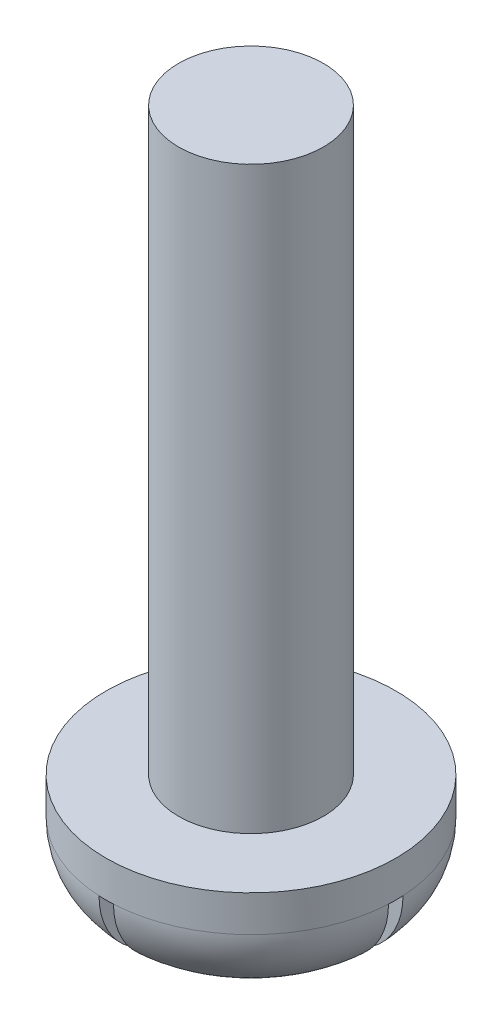
ISO-10303-21;
HEADER;
FILE_DESCRIPTION(('STEP AP214'),'2;1');
FILE_NAME('part.step','',(''),(''),'','','');
FILE_SCHEMA(('AUTOMOTIVE_DESIGN { 1 0 10303 214 1 1 1 1 }'));
ENDSEC;
DATA;
#1=APPLICATION_CONTEXT('core data for automotive mechanical design processes');
#2=APPLICATION_PROTOCOL_DEFINITION('international standard','automotive_design',2000,#1);
#3=PRODUCT_CONTEXT('',#1,'mechanical');
#4=PRODUCT('Part','Part','',(#3));
#5=PRODUCT_RELATED_PRODUCT_CATEGORY('part','',(#4));
#6=PRODUCT_DEFINITION_FORMATION('','',#4);
#7=PRODUCT_DEFINITION_CONTEXT('part definition',#1,'design');
#8=PRODUCT_DEFINITION('design','',#6,#7);
#9=PRODUCT_DEFINITION_SHAPE('','',#8);
#10=(LENGTH_UNIT() NAMED_UNIT(*) SI_UNIT(.MILLI.,.METRE.));
#11=(NAMED_UNIT(*) PLANE_ANGLE_UNIT() SI_UNIT($,.RADIAN.));
#12=(NAMED_UNIT(*) SI_UNIT($,.STERADIAN.) SOLID_ANGLE_UNIT());
#13=UNCERTAINTY_MEASURE_WITH_UNIT(LENGTH_MEASURE(1.E-05),#10,'distance_accuracy_value','');
#14=(GEOMETRIC_REPRESENTATION_CONTEXT(3) GLOBAL_UNCERTAINTY_ASSIGNED_CONTEXT((#13)) GLOBAL_UNIT_ASSIGNED_CONTEXT((#10,
#11,#12)) REPRESENTATION_CONTEXT('',''));
#15=CARTESIAN_POINT('',(0.,0.,0.));
#16=DIRECTION('',(0.,0.,1.));
#17=DIRECTION('',(1.,0.,0.));
#18=AXIS2_PLACEMENT_3D('',#15,#16,#17);
#19=CARTESIAN_POINT('',(0.,-1.5,0.));
#20=DIRECTION('',(0.,1.,0.));
#21=DIRECTION('',(0.,0.,1.));
#22=AXIS2_PLACEMENT_3D('',#19,#20,#21);
#23=CYLINDRICAL_SURFACE('',#22,2.);
#24=CARTESIAN_POINT('',(0.,0.,0.));
#25=DIRECTION('',(0.,1.,0.));
#26=DIRECTION('',(0.,0.,1.));
#27=AXIS2_PLACEMENT_3D('',#24,#25,#26);
#28=CIRCLE('',#27,2.);
#29=CARTESIAN_POINT('',(0.,0.,2.));
#30=VERTEX_POINT('',#29);
#31=EDGE_CURVE('E231',#30,#30,#28,.T.);
#32=ORIENTED_EDGE('',*,*,#31,.F.);
#33=EDGE_LOOP('',(#32));
#34=FACE_BOUND('',#33,.T.);
#35=CARTESIAN_POINT('',(0.,-0.5,0.));
#36=DIRECTION('',(0.,1.,0.));
#37=DIRECTION('',(0.,0.,1.));
#38=AXIS2_PLACEMENT_3D('',#35,#36,#37);
#39=CIRCLE('',#38,2.);
#40=CARTESIAN_POINT('',(0.100000000000001,-0.5,1.99749843554382));
#41=VERTEX_POINT('',#40);
#42=CARTESIAN_POINT('',(-0.0999999999999994,-0.5,1.99749843554382));
#43=VERTEX_POINT('',#42);
#44=EDGE_CURVE('E257',#41,#43,#39,.F.);
#45=ORIENTED_EDGE('',*,*,#44,.F.);
#46=CARTESIAN_POINT('',(0.,-0.5,0.));
#47=DIRECTION('',(0.,1.,0.));
#48=DIRECTION('',(0.,0.,1.));
#49=AXIS2_PLACEMENT_3D('',#46,#47,#48);
#50=CIRCLE('',#49,2.);
#51=CARTESIAN_POINT('',(1.99749843554382,-0.5,0.1));
#52=VERTEX_POINT('',#51);
#53=EDGE_CURVE('E267',#41,#52,#50,.T.);
#54=ORIENTED_EDGE('',*,*,#53,.T.);
#55=CARTESIAN_POINT('',(1.99749843554382,-0.5,-0.1));
#56=VERTEX_POINT('',#55);
#57=EDGE_CURVE('E363',#56,#52,#39,.F.);
#58=ORIENTED_EDGE('',*,*,#57,.F.);
#59=CARTESIAN_POINT('',(0.,-0.5,0.));
#60=DIRECTION('',(0.,1.,0.));
#61=DIRECTION('',(0.,0.,1.));
#62=AXIS2_PLACEMENT_3D('',#59,#60,#61);
#63=CIRCLE('',#62,2.);
#64=CARTESIAN_POINT('',(0.100000000000001,-0.5,-1.99749843554382));
#65=VERTEX_POINT('',#64);
#66=EDGE_CURVE('E258',#56,#65,#63,.T.);
#67=ORIENTED_EDGE('',*,*,#66,.T.);
#68=CARTESIAN_POINT('',(-0.0999999999999994,-0.5,-1.99749843554382));
#69=VERTEX_POINT('',#68);
#70=EDGE_CURVE('E255',#69,#65,#39,.F.);
#71=ORIENTED_EDGE('',*,*,#70,.F.);
#72=CARTESIAN_POINT('',(0.,-0.5,0.));
#73=DIRECTION('',(0.,1.,0.));
#74=DIRECTION('',(0.,0.,1.));
#75=AXIS2_PLACEMENT_3D('',#72,#73,#74);
#76=CIRCLE('',#75,2.);
#77=CARTESIAN_POINT('',(-1.99749843554382,-0.5,-0.1));
#78=VERTEX_POINT('',#77);
#79=EDGE_CURVE('E261',#69,#78,#76,.T.);
#80=ORIENTED_EDGE('',*,*,#79,.T.);
#81=CARTESIAN_POINT('',(-1.99749843554382,-0.5,0.1));
#82=VERTEX_POINT('',#81);
#83=EDGE_CURVE('E193',#82,#78,#39,.F.);
#84=ORIENTED_EDGE('',*,*,#83,.F.);
#85=CARTESIAN_POINT('',(0.,-0.5,0.));
#86=DIRECTION('',(0.,1.,0.));
#87=DIRECTION('',(0.,0.,1.));
#88=AXIS2_PLACEMENT_3D('',#85,#86,#87);
#89=CIRCLE('',#88,2.);
#90=EDGE_CURVE('E264',#82,#43,#89,.T.);
#91=ORIENTED_EDGE('',*,*,#90,.T.);
#92=EDGE_LOOP('',(#45,#54,#58,#67,#71,#80,#84,#91));
#93=FACE_BOUND('',#92,.T.);
#94=ADVANCED_FACE('F89',(#34,#93),#23,.T.);
#95=CARTESIAN_POINT('',(0.,-1.5,0.));
#96=DIRECTION('',(0.,1.,0.));
#97=DIRECTION('',(0.,0.,1.));
#98=AXIS2_PLACEMENT_3D('',#95,#96,#97);
#99=PLANE('',#98);
#100=DIRECTION('',(1.,0.,0.));
#101=VECTOR('',#100,1.);
#102=CARTESIAN_POINT('',(0.,-1.5,-0.1));
#103=LINE('',#102,#101);
#104=CARTESIAN_POINT('',(-0.99498743710662,-1.5,-0.1));
#105=VERTEX_POINT('',#104);
#106=CARTESIAN_POINT('',(-0.0999999999999994,-1.5,-0.1));
#107=VERTEX_POINT('',#106);
#108=EDGE_CURVE('E203',#105,#107,#103,.T.);
#109=ORIENTED_EDGE('',*,*,#108,.F.);
#110=CARTESIAN_POINT('',(0.,-1.5,0.));
#111=DIRECTION('',(0.,1.,0.));
#112=DIRECTION('',(0.,0.,1.));
#113=AXIS2_PLACEMENT_3D('',#110,#111,#112);
#114=CIRCLE('',#113,1.);
#115=CARTESIAN_POINT('',(-0.0999999999999994,-1.5,-0.99498743710662));
#116=VERTEX_POINT('',#115);
#117=EDGE_CURVE('E341',#105,#116,#114,.F.);
#118=ORIENTED_EDGE('',*,*,#117,.T.);
#119=DIRECTION('',(0.,0.,1.));
#120=VECTOR('',#119,1.);
#121=CARTESIAN_POINT('',(-0.0999999999999994,-1.5,0.));
#122=LINE('',#121,#120);
#123=EDGE_CURVE('E252',#116,#107,#122,.T.);
#124=ORIENTED_EDGE('',*,*,#123,.T.);
#125=EDGE_LOOP('',(#109,#118,#124));
#126=FACE_BOUND('',#125,.T.);
#127=ADVANCED_FACE('F349',(#126),#99,.F.);
#128=DIRECTION('',(0.,0.,1.));
#129=VECTOR('',#128,1.);
#130=CARTESIAN_POINT('',(0.100000000000001,-1.5,0.));
#131=LINE('',#130,#129);
#132=CARTESIAN_POINT('',(0.100000000000001,-1.5,-0.99498743710662));
#133=VERTEX_POINT('',#132);
#134=CARTESIAN_POINT('',(0.100000000000001,-1.5,-0.1));
#135=VERTEX_POINT('',#134);
#136=EDGE_CURVE('E248',#133,#135,#131,.T.);
#137=ORIENTED_EDGE('',*,*,#136,.F.);
#138=CARTESIAN_POINT('',(0.,-1.5,0.));
#139=DIRECTION('',(0.,1.,0.));
#140=DIRECTION('',(0.,0.,1.));
#141=AXIS2_PLACEMENT_3D('',#138,#139,#140);
#142=CIRCLE('',#141,1.);
#143=CARTESIAN_POINT('',(0.99498743710662,-1.5,-0.1));
#144=VERTEX_POINT('',#143);
#145=EDGE_CURVE('E103',#133,#144,#142,.F.);
#146=ORIENTED_EDGE('',*,*,#145,.T.);
#147=DIRECTION('',(1.,0.,0.));
#148=VECTOR('',#147,1.);
#149=CARTESIAN_POINT('',(0.,-1.5,-0.1));
#150=LINE('',#149,#148);
#151=EDGE_CURVE('E250',#135,#144,#150,.T.);
#152=ORIENTED_EDGE('',*,*,#151,.F.);
#153=EDGE_LOOP('',(#137,#146,#152));
#154=FACE_BOUND('',#153,.T.);
#155=ADVANCED_FACE('F375',(#154),#99,.F.);
#156=DIRECTION('',(0.,0.,1.));
#157=VECTOR('',#156,1.);
#158=CARTESIAN_POINT('',(-0.0999999999999994,-1.5,0.));
#159=LINE('',#158,#157);
#160=CARTESIAN_POINT('',(-0.0999999999999994,-1.5,0.1));
#161=VERTEX_POINT('',#160);
#162=CARTESIAN_POINT('',(-0.0999999999999994,-1.5,0.99498743710662));
#163=VERTEX_POINT('',#162);
#164=EDGE_CURVE('E243',#161,#163,#159,.T.);
#165=ORIENTED_EDGE('',*,*,#164,.T.);
#166=CARTESIAN_POINT('',(0.,-1.5,0.));
#167=DIRECTION('',(0.,1.,0.));
#168=DIRECTION('',(0.,0.,1.));
#169=AXIS2_PLACEMENT_3D('',#166,#167,#168);
#170=CIRCLE('',#169,1.);
#171=CARTESIAN_POINT('',(-0.99498743710662,-1.5,0.1));
#172=VERTEX_POINT('',#171);
#173=EDGE_CURVE('E303',#163,#172,#170,.F.);
#174=ORIENTED_EDGE('',*,*,#173,.T.);
#175=DIRECTION('',(1.,0.,0.));
#176=VECTOR('',#175,1.);
#177=CARTESIAN_POINT('',(0.,-1.5,0.1));
#178=LINE('',#177,#176);
#179=EDGE_CURVE('E246',#172,#161,#178,.T.);
#180=ORIENTED_EDGE('',*,*,#179,.T.);
#181=EDGE_LOOP('',(#165,#174,#180));
#182=FACE_BOUND('',#181,.T.);
#183=ADVANCED_FACE('F386',(#182),#99,.F.);
#184=DIRECTION('',(1.,0.,0.));
#185=VECTOR('',#184,1.);
#186=CARTESIAN_POINT('',(0.,-1.5,0.1));
#187=LINE('',#186,#185);
#188=CARTESIAN_POINT('',(0.100000000000001,-1.5,0.1));
#189=VERTEX_POINT('',#188);
#190=CARTESIAN_POINT('',(0.99498743710662,-1.5,0.1));
#191=VERTEX_POINT('',#190);
#192=EDGE_CURVE('E240',#189,#191,#187,.T.);
#193=ORIENTED_EDGE('',*,*,#192,.T.);
#194=CARTESIAN_POINT('',(0.,-1.5,0.));
#195=DIRECTION('',(0.,1.,0.));
#196=DIRECTION('',(0.,0.,1.));
#197=AXIS2_PLACEMENT_3D('',#194,#195,#196);
#198=CIRCLE('',#197,1.);
#199=CARTESIAN_POINT('',(0.100000000000001,-1.5,0.99498743710662));
#200=VERTEX_POINT('',#199);
#201=EDGE_CURVE('E278',#191,#200,#198,.F.);
#202=ORIENTED_EDGE('',*,*,#201,.T.);
#203=DIRECTION('',(0.,0.,1.));
#204=VECTOR('',#203,1.);
#205=CARTESIAN_POINT('',(0.100000000000001,-1.5,0.));
#206=LINE('',#205,#204);
#207=EDGE_CURVE('E235',#189,#200,#206,.T.);
#208=ORIENTED_EDGE('',*,*,#207,.F.);
#209=EDGE_LOOP('',(#193,#202,#208));
#210=FACE_BOUND('',#209,.T.);
#211=ADVANCED_FACE('F377',(#210),#99,.F.);
#212=CARTESIAN_POINT('',(0.,0.,0.));
#213=DIRECTION('',(0.,1.,0.));
#214=DIRECTION('',(0.,0.,1.));
#215=AXIS2_PLACEMENT_3D('',#212,#213,#214);
#216=PLANE('',#215);
#217=CARTESIAN_POINT('',(0.,0.,0.));
#218=DIRECTION('',(0.,1.,0.));
#219=DIRECTION('',(0.,0.,1.));
#220=AXIS2_PLACEMENT_3D('',#217,#218,#219);
#221=CIRCLE('',#220,1.);
#222=CARTESIAN_POINT('',(0.,0.,1.));
#223=VERTEX_POINT('',#222);
#224=EDGE_CURVE('E232',#223,#223,#221,.T.);
#225=ORIENTED_EDGE('',*,*,#224,.F.);
#226=EDGE_LOOP('',(#225));
#227=FACE_BOUND('',#226,.T.);
#228=ORIENTED_EDGE('',*,*,#31,.T.);
#229=EDGE_LOOP('',(#228));
#230=FACE_BOUND('',#229,.T.);
#231=ADVANCED_FACE('F380',(#227,#230),#216,.T.);
#232=CARTESIAN_POINT('',(0.,8.,0.));
#233=DIRECTION('',(0.,-1.,0.));
#234=DIRECTION('',(0.,0.,-1.));
#235=AXIS2_PLACEMENT_3D('',#232,#233,#234);
#236=CYLINDRICAL_SURFACE('',#235,1.);
#237=CARTESIAN_POINT('',(0.,8.,0.));
#238=DIRECTION('',(0.,1.,0.));
#239=DIRECTION('',(0.,0.,1.));
#240=AXIS2_PLACEMENT_3D('',#237,#238,#239);
#241=CIRCLE('',#240,1.);
#242=CARTESIAN_POINT('',(0.,8.,1.));
#243=VERTEX_POINT('',#242);
#244=EDGE_CURVE('E228',#243,#243,#241,.T.);
#245=ORIENTED_EDGE('',*,*,#244,.F.);
#246=EDGE_LOOP('',(#245));
#247=FACE_BOUND('',#246,.T.);
#248=ORIENTED_EDGE('',*,*,#224,.T.);
#249=EDGE_LOOP('',(#248));
#250=FACE_BOUND('',#249,.T.);
#251=ADVANCED_FACE('F382',(#247,#250),#236,.T.);
#252=CARTESIAN_POINT('',(0.,8.,0.));
#253=DIRECTION('',(0.,1.,0.));
#254=DIRECTION('',(0.,0.,1.));
#255=AXIS2_PLACEMENT_3D('',#252,#253,#254);
#256=PLANE('',#255);
#257=ORIENTED_EDGE('',*,*,#244,.T.);
#258=EDGE_LOOP('',(#257));
#259=FACE_BOUND('',#258,.T.);
#260=ADVANCED_FACE('F389',(#259),#256,.T.);
#261=CARTESIAN_POINT('',(-2.,-1.500012,-0.1));
#262=DIRECTION('',(0.,0.,1.));
#263=DIRECTION('',(1.,0.,0.));
#264=AXIS2_PLACEMENT_3D('',#261,#262,#263);
#265=PLANE('',#264);
#266=ORIENTED_EDGE('',*,*,#151,.T.);
#267=CARTESIAN_POINT('',(0.99498743710662,-1.5,-0.1));
#268=CARTESIAN_POINT('',(1.02331821335249,-1.49999996996315,-0.1));
#269=CARTESIAN_POINT('',(1.05163574372128,-1.49880729949403,-0.1));
#270=CARTESIAN_POINT('',(1.10806949334507,-1.49404423841916,-0.1));
#271=CARTESIAN_POINT('',(1.13618571633081,-1.49047389199378,-0.1));
#272=CARTESIAN_POINT('',(1.21988656813146,-1.47622212321595,-0.1));
#273=CARTESIAN_POINT('',(1.27491088705168,-1.46199991423278,-0.1));
#274=CARTESIAN_POINT('',(1.38174148327078,-1.42449901310052,-0.1));
#275=CARTESIAN_POINT('',(1.43354825970488,-1.40122172974898,-0.1));
#276=CARTESIAN_POINT('',(1.53248934408289,-1.3462658298641,-0.1));
#277=CARTESIAN_POINT('',(1.57962477580312,-1.31458924070805,-0.1));
#278=CARTESIAN_POINT('',(1.66767253400877,-1.24389143883173,-0.1));
#279=CARTESIAN_POINT('',(1.70861157005451,-1.20490347144944,-0.1));
#280=CARTESIAN_POINT('',(1.78335661557813,-1.12058583135484,-0.1));
#281=CARTESIAN_POINT('',(1.81716117995925,-1.07525487694834,-0.1));
#282=CARTESIAN_POINT('',(1.87660367590102,-0.979639850735611,-0.1));
#283=CARTESIAN_POINT('',(1.90225596538467,-0.929364693613435,-0.1));
#284=CARTESIAN_POINT('',(1.94473328913296,-0.8252293358305,-0.1));
#285=CARTESIAN_POINT('',(1.96156378507989,-0.771371376660514,-0.1));
#286=CARTESIAN_POINT('',(1.98164141439204,-0.680974380367145,-0.1));
#287=CARTESIAN_POINT('',(1.98758443417955,-0.645011214276785,-0.1));
#288=CARTESIAN_POINT('',(1.99551223727195,-0.572703786776848,-0.1));
#289=CARTESIAN_POINT('',(1.99750271237168,-0.536360149241403,-0.1));
#290=CARTESIAN_POINT('',(1.99749843554382,-0.5,-0.1));
#291=B_SPLINE_CURVE_WITH_KNOTS('',3,(#267,#268,#269,#270,#271,#272,#273,#274,#275,#276,#277,
#278,#279,#280,#281,#282,#283,#284,#285,#286,#287,#288,#289,#290),.UNSPECIFIED.,.F.,.F.,(4,2,2,
2,2,2,2,2,2,2,2,4),(0.,0.0849406781167001,0.169879777966962,0.339498799069642,0.509091441222281,
0.678643185259543,0.847441880548863,1.01627473349505,1.18480856578623,1.35323793306923,
1.46238903653949,1.57138284450026),.UNSPECIFIED.);
#292=EDGE_CURVE('E12',#144,#56,#291,.T.);
#293=ORIENTED_EDGE('',*,*,#292,.T.);
#294=DIRECTION('',(1.,0.,0.));
#295=VECTOR('',#294,1.);
#296=CARTESIAN_POINT('',(-2.,-0.5,-0.1));
#297=LINE('',#296,#295);
#298=CARTESIAN_POINT('',(0.100000000000001,-0.5,-0.1));
#299=VERTEX_POINT('',#298);
#300=EDGE_CURVE('E196',#299,#56,#297,.T.);
#301=ORIENTED_EDGE('',*,*,#300,.F.);
#302=DIRECTION('',(0.,-1.,0.));
#303=VECTOR('',#302,1.);
#304=CARTESIAN_POINT('',(0.100000000000001,-1.500012,-0.1));
#305=LINE('',#304,#303);
#306=EDGE_CURVE('E225',#299,#135,#305,.T.);
#307=ORIENTED_EDGE('',*,*,#306,.T.);
#308=EDGE_LOOP('',(#266,#293,#301,#307));
#309=FACE_BOUND('',#308,.T.);
#310=ADVANCED_FACE('F359',(#309),#265,.T.);
#311=CARTESIAN_POINT('',(-2.,-1.500012,0.1));
#312=DIRECTION('',(0.,0.,1.));
#313=DIRECTION('',(1.,0.,0.));
#314=AXIS2_PLACEMENT_3D('',#311,#312,#313);
#315=PLANE('',#314);
#316=DIRECTION('',(1.,0.,0.));
#317=VECTOR('',#316,1.);
#318=CARTESIAN_POINT('',(-2.,-0.5,0.1));
#319=LINE('',#318,#317);
#320=CARTESIAN_POINT('',(0.100000000000001,-0.5,0.1));
#321=VERTEX_POINT('',#320);
#322=EDGE_CURVE('E195',#321,#52,#319,.T.);
#323=ORIENTED_EDGE('',*,*,#322,.T.);
#324=CARTESIAN_POINT('',(1.99749843554382,-0.5,0.1));
#325=CARTESIAN_POINT('',(1.99749825777726,-0.52810497117014,0.1));
#326=CARTESIAN_POINT('',(1.99631137236725,-0.556196473310876,0.1));
#327=CARTESIAN_POINT('',(1.99157646779227,-0.612178350224322,0.1));
#328=CARTESIAN_POINT('',(1.98802856501171,-0.640068734842457,0.1));
#329=CARTESIAN_POINT('',(1.97387739169901,-0.723088328365686,0.1));
#330=CARTESIAN_POINT('',(1.95976656055544,-0.777661262583887,0.1));
#331=CARTESIAN_POINT('',(1.92258420158717,-0.883661678381409,0.1));
#332=CARTESIAN_POINT('',(1.89950843274077,-0.935087657890615,0.1));
#333=CARTESIAN_POINT('',(1.84505575517323,-1.03333625867376,0.1));
#334=CARTESIAN_POINT('',(1.81368022911593,-1.08015964491736,0.1));
#335=CARTESIAN_POINT('',(1.74350874081588,-1.16789261192876,0.1));
#336=CARTESIAN_POINT('',(1.70471028588486,-1.20880019799029,0.1));
#337=CARTESIAN_POINT('',(1.62079459523457,-1.28353742932022,0.1));
#338=CARTESIAN_POINT('',(1.57567622567505,-1.31736580180238,0.1));
#339=CARTESIAN_POINT('',(1.48035328650548,-1.37702242580202,0.1));
#340=CARTESIAN_POINT('',(1.430142224407,-1.4028402905005,0.1));
#341=CARTESIAN_POINT('',(1.32611336664471,-1.44569000774303,0.1));
#342=CARTESIAN_POINT('',(1.27229745582206,-1.46272641188821,0.1));
#343=CARTESIAN_POINT('',(1.18097080491316,-1.48341130577798,0.1));
#344=CARTESIAN_POINT('',(1.14402144742461,-1.48963123557399,0.1));
#345=CARTESIAN_POINT('',(1.06971520300602,-1.49792535280229,0.1));
#346=CARTESIAN_POINT('',(1.03235899379958,-1.50000561152962,0.1));
#347=CARTESIAN_POINT('',(0.99498743710662,-1.5,0.1));
#348=B_SPLINE_CURVE_WITH_KNOTS('',3,(#324,#325,#326,#327,#328,#329,#330,#331,#332,#333,#334,
#335,#336,#337,#338,#339,#340,#341,#342,#343,#344,#345,#346,#347),.UNSPECIFIED.,.F.,.F.,(4,2,2,
2,2,2,2,2,2,2,2,4),(0.,0.0842631084806962,0.168522063588081,0.336757756437839,0.50507313324711,
0.673360487888784,0.841704454490896,1.01007866204348,1.17867028820165,1.34717444196047,
1.45936544193442,1.57139177951544),.UNSPECIFIED.);
#349=EDGE_CURVE('E270',#52,#191,#348,.T.);
#350=ORIENTED_EDGE('',*,*,#349,.T.);
#351=ORIENTED_EDGE('',*,*,#192,.F.);
#352=DIRECTION('',(0.,-1.,0.));
#353=VECTOR('',#352,1.);
#354=CARTESIAN_POINT('',(0.100000000000001,-1.500012,0.1));
#355=LINE('',#354,#353);
#356=EDGE_CURVE('E223',#321,#189,#355,.T.);
#357=ORIENTED_EDGE('',*,*,#356,.F.);
#358=EDGE_LOOP('',(#323,#350,#351,#357));
#359=FACE_BOUND('',#358,.T.);
#360=ADVANCED_FACE('F289',(#359),#315,.F.);
#361=CARTESIAN_POINT('',(-0.0999999999999994,-0.5,-0.1));
#362=VERTEX_POINT('',#361);
#363=EDGE_CURVE('E184',#78,#362,#297,.T.);
#364=ORIENTED_EDGE('',*,*,#363,.F.);
#365=CARTESIAN_POINT('',(-1.99749843554382,-0.5,-0.1));
#366=CARTESIAN_POINT('',(-1.99749825777726,-0.52810497117014,-0.1));
#367=CARTESIAN_POINT('',(-1.99631137236725,-0.556196473310876,-0.1));
#368=CARTESIAN_POINT('',(-1.99157646779227,-0.612178350224322,-0.1));
#369=CARTESIAN_POINT('',(-1.98802856501171,-0.640068734842457,-0.1));
#370=CARTESIAN_POINT('',(-1.97387739169901,-0.723088328365686,-0.1));
#371=CARTESIAN_POINT('',(-1.95976656055544,-0.777661262583887,-0.1));
#372=CARTESIAN_POINT('',(-1.92258420158717,-0.883661678381409,-0.1));
#373=CARTESIAN_POINT('',(-1.89950843274077,-0.935087657890615,-0.1));
#374=CARTESIAN_POINT('',(-1.84505575517323,-1.03333625867376,-0.1));
#375=CARTESIAN_POINT('',(-1.81368022911593,-1.08015964491736,-0.1));
#376=CARTESIAN_POINT('',(-1.74350874081588,-1.16789261192876,-0.1));
#377=CARTESIAN_POINT('',(-1.70471028588486,-1.20880019799029,-0.1));
#378=CARTESIAN_POINT('',(-1.62079459523457,-1.28353742932022,-0.1));
#379=CARTESIAN_POINT('',(-1.57567622567505,-1.31736580180238,-0.1));
#380=CARTESIAN_POINT('',(-1.48035328650548,-1.37702242580202,-0.1));
#381=CARTESIAN_POINT('',(-1.430142224407,-1.4028402905005,-0.1));
#382=CARTESIAN_POINT('',(-1.32611336664471,-1.44569000774303,-0.1));
#383=CARTESIAN_POINT('',(-1.27229745582206,-1.46272641188821,-0.1));
#384=CARTESIAN_POINT('',(-1.18097080491316,-1.48341130577798,-0.1));
#385=CARTESIAN_POINT('',(-1.14402144742461,-1.48963123557399,-0.1));
#386=CARTESIAN_POINT('',(-1.06971520300602,-1.49792535280229,-0.1));
#387=CARTESIAN_POINT('',(-1.03235899379958,-1.50000561152962,-0.1));
#388=CARTESIAN_POINT('',(-0.99498743710662,-1.5,-0.1));
#389=B_SPLINE_CURVE_WITH_KNOTS('',3,(#365,#366,#367,#368,#369,#370,#371,#372,#373,#374,#375,
#376,#377,#378,#379,#380,#381,#382,#383,#384,#385,#386,#387,#388),.UNSPECIFIED.,.F.,.F.,(4,2,2,
2,2,2,2,2,2,2,2,4),(0.,0.0842631084806962,0.168522063588081,0.336757756437839,0.50507313324711,
0.673360487888784,0.841704454490896,1.01007866204348,1.17867028820165,1.34717444196047,
1.45936544193442,1.57139177951544),.UNSPECIFIED.);
#390=EDGE_CURVE('E302',#78,#105,#389,.T.);
#391=ORIENTED_EDGE('',*,*,#390,.T.);
#392=ORIENTED_EDGE('',*,*,#108,.T.);
#393=DIRECTION('',(0.,1.,0.));
#394=VECTOR('',#393,1.);
#395=CARTESIAN_POINT('',(-0.0999999999999994,-0.5,-0.1));
#396=LINE('',#395,#394);
#397=EDGE_CURVE('E200',#107,#362,#396,.T.);
#398=ORIENTED_EDGE('',*,*,#397,.T.);
#399=EDGE_LOOP('',(#364,#391,#392,#398));
#400=FACE_BOUND('',#399,.T.);
#401=ADVANCED_FACE('F201',(#400),#265,.T.);
#402=ORIENTED_EDGE('',*,*,#179,.F.);
#403=CARTESIAN_POINT('',(-0.99498743710662,-1.5,0.1));
#404=CARTESIAN_POINT('',(-1.02331821335249,-1.49999996996315,0.1));
#405=CARTESIAN_POINT('',(-1.05163574372128,-1.49880729949403,0.1));
#406=CARTESIAN_POINT('',(-1.10806949334507,-1.49404423841916,0.1));
#407=CARTESIAN_POINT('',(-1.13618571633081,-1.49047389199378,0.1));
#408=CARTESIAN_POINT('',(-1.21988656813146,-1.47622212321595,0.1));
#409=CARTESIAN_POINT('',(-1.27491088705168,-1.46199991423278,0.1));
#410=CARTESIAN_POINT('',(-1.38174148327078,-1.42449901310052,0.1));
#411=CARTESIAN_POINT('',(-1.43354825970488,-1.40122172974898,0.1));
#412=CARTESIAN_POINT('',(-1.53248934408289,-1.3462658298641,0.1));
#413=CARTESIAN_POINT('',(-1.57962477580312,-1.31458924070805,0.1));
#414=CARTESIAN_POINT('',(-1.66767253400877,-1.24389143883173,0.1));
#415=CARTESIAN_POINT('',(-1.70861157005451,-1.20490347144944,0.1));
#416=CARTESIAN_POINT('',(-1.78335661557813,-1.12058583135484,0.1));
#417=CARTESIAN_POINT('',(-1.81716117995925,-1.07525487694834,0.1));
#418=CARTESIAN_POINT('',(-1.87660367590102,-0.979639850735611,0.1));
#419=CARTESIAN_POINT('',(-1.90225596538467,-0.929364693613435,0.1));
#420=CARTESIAN_POINT('',(-1.94473328913296,-0.8252293358305,0.1));
#421=CARTESIAN_POINT('',(-1.96156378507989,-0.771371376660514,0.1));
#422=CARTESIAN_POINT('',(-1.98164141439204,-0.680974380367145,0.1));
#423=CARTESIAN_POINT('',(-1.98758443417955,-0.645011214276785,0.1));
#424=CARTESIAN_POINT('',(-1.99551223727195,-0.572703786776848,0.1));
#425=CARTESIAN_POINT('',(-1.99750271237168,-0.536360149241403,0.1));
#426=CARTESIAN_POINT('',(-1.99749843554382,-0.5,0.1));
#427=B_SPLINE_CURVE_WITH_KNOTS('',3,(#403,#404,#405,#406,#407,#408,#409,#410,#411,#412,#413,
#414,#415,#416,#417,#418,#419,#420,#421,#422,#423,#424,#425,#426),.UNSPECIFIED.,.F.,.F.,(4,2,2,
2,2,2,2,2,2,2,2,4),(0.,0.0849406781167001,0.169879777966962,0.339498799069642,0.509091441222281,
0.678643185259543,0.847441880548863,1.01627473349505,1.18480856578623,1.35323793306923,
1.46238903653949,1.57138284450026),.UNSPECIFIED.);
#428=EDGE_CURVE('E295',#172,#82,#427,.T.);
#429=ORIENTED_EDGE('',*,*,#428,.T.);
#430=CARTESIAN_POINT('',(-0.0999999999999994,-0.5,0.1));
#431=VERTEX_POINT('',#430);
#432=EDGE_CURVE('E221',#82,#431,#319,.T.);
#433=ORIENTED_EDGE('',*,*,#432,.T.);
#434=DIRECTION('',(0.,1.,0.));
#435=VECTOR('',#434,1.);
#436=CARTESIAN_POINT('',(-0.0999999999999994,-0.5,0.1));
#437=LINE('',#436,#435);
#438=EDGE_CURVE('E206',#161,#431,#437,.T.);
#439=ORIENTED_EDGE('',*,*,#438,.F.);
#440=EDGE_LOOP('',(#402,#429,#433,#439));
#441=FACE_BOUND('',#440,.T.);
#442=ADVANCED_FACE('F284',(#441),#315,.F.);
#443=CARTESIAN_POINT('',(-0.0999999999999994,-0.5,2.));
#444=DIRECTION('',(-1.,0.,0.));
#445=DIRECTION('',(0.,0.,1.));
#446=AXIS2_PLACEMENT_3D('',#443,#444,#445);
#447=PLANE('',#446);
#448=ORIENTED_EDGE('',*,*,#123,.F.);
#449=CARTESIAN_POINT('',(-0.0999999999999994,-1.5,-0.99498743710662));
#450=CARTESIAN_POINT('',(-0.0999999999999994,-1.49999996996315,-1.02331821335249));
#451=CARTESIAN_POINT('',(-0.0999999999999994,-1.49880729949403,-1.05163574372128));
#452=CARTESIAN_POINT('',(-0.0999999999999994,-1.49404423841916,-1.10806949334507));
#453=CARTESIAN_POINT('',(-0.0999999999999994,-1.49047389199378,-1.13618571633081));
#454=CARTESIAN_POINT('',(-0.0999999999999994,-1.47622212321595,-1.21988656813146));
#455=CARTESIAN_POINT('',(-0.0999999999999994,-1.46199991423278,-1.27491088705168));
#456=CARTESIAN_POINT('',(-0.0999999999999994,-1.42449901310052,-1.38174148327078));
#457=CARTESIAN_POINT('',(-0.0999999999999994,-1.40122172974898,-1.43354825970488));
#458=CARTESIAN_POINT('',(-0.0999999999999994,-1.3462658298641,-1.53248934408289));
#459=CARTESIAN_POINT('',(-0.0999999999999994,-1.31458924070805,-1.57962477580312));
#460=CARTESIAN_POINT('',(-0.0999999999999994,-1.24389143883173,-1.66767253400877));
#461=CARTESIAN_POINT('',(-0.0999999999999994,-1.20490347144944,-1.70861157005451));
#462=CARTESIAN_POINT('',(-0.0999999999999994,-1.12058583135484,-1.78335661557813));
#463=CARTESIAN_POINT('',(-0.0999999999999994,-1.07525487694834,-1.81716117995925));
#464=CARTESIAN_POINT('',(-0.0999999999999994,-0.979639850735612,-1.87660367590101));
#465=CARTESIAN_POINT('',(-0.0999999999999994,-0.929364693613435,-1.90225596538467));
#466=CARTESIAN_POINT('',(-0.0999999999999994,-0.8252293358305,-1.94473328913296));
#467=CARTESIAN_POINT('',(-0.0999999999999994,-0.771371376660514,-1.96156378507989));
#468=CARTESIAN_POINT('',(-0.0999999999999994,-0.680974380367145,-1.98164141439204));
#469=CARTESIAN_POINT('',(-0.0999999999999994,-0.645011214276785,-1.98758443417955));
#470=CARTESIAN_POINT('',(-0.0999999999999994,-0.572703786776848,-1.99551223727195));
#471=CARTESIAN_POINT('',(-0.0999999999999994,-0.536360149241403,-1.99750271237168));
#472=CARTESIAN_POINT('',(-0.0999999999999994,-0.5,-1.99749843554382));
#473=B_SPLINE_CURVE_WITH_KNOTS('',3,(#449,#450,#451,#452,#453,#454,#455,#456,#457,#458,#459,
#460,#461,#462,#463,#464,#465,#466,#467,#468,#469,#470,#471,#472),.UNSPECIFIED.,.F.,.F.,(4,2,2,
2,2,2,2,2,2,2,2,4),(0.,0.0849406781167001,0.169879777966962,0.339498799069642,0.509091441222281,
0.678643185259543,0.847441880548863,1.01627473349505,1.18480856578623,1.35323793306923,
1.46238903653949,1.57138284450026),.UNSPECIFIED.);
#474=EDGE_CURVE('E210',#116,#69,#473,.T.);
#475=ORIENTED_EDGE('',*,*,#474,.T.);
#476=DIRECTION('',(0.,0.,1.));
#477=VECTOR('',#476,1.);
#478=CARTESIAN_POINT('',(-0.0999999999999994,-0.5,2.));
#479=LINE('',#478,#477);
#480=EDGE_CURVE('E190',#362,#69,#479,.F.);
#481=ORIENTED_EDGE('',*,*,#480,.F.);
#482=ORIENTED_EDGE('',*,*,#397,.F.);
#483=EDGE_LOOP('',(#448,#475,#481,#482));
#484=FACE_BOUND('',#483,.T.);
#485=ADVANCED_FACE('F208',(#484),#447,.F.);
#486=CARTESIAN_POINT('',(0.100000000000001,-0.5,2.));
#487=DIRECTION('',(-1.,0.,0.));
#488=DIRECTION('',(0.,0.,1.));
#489=AXIS2_PLACEMENT_3D('',#486,#487,#488);
#490=PLANE('',#489);
#491=DIRECTION('',(0.,0.,1.));
#492=VECTOR('',#491,1.);
#493=CARTESIAN_POINT('',(0.100000000000001,-0.5,2.));
#494=LINE('',#493,#492);
#495=EDGE_CURVE('E215',#299,#65,#494,.F.);
#496=ORIENTED_EDGE('',*,*,#495,.T.);
#497=CARTESIAN_POINT('',(0.100000000000001,-0.5,-1.99749843554382));
#498=CARTESIAN_POINT('',(0.100000000000001,-0.52810497117014,-1.99749825777726));
#499=CARTESIAN_POINT('',(0.100000000000001,-0.556196473310876,-1.99631137236725));
#500=CARTESIAN_POINT('',(0.100000000000001,-0.612178350224322,-1.99157646779227));
#501=CARTESIAN_POINT('',(0.100000000000001,-0.640068734842457,-1.98802856501171));
#502=CARTESIAN_POINT('',(0.100000000000001,-0.723088328365686,-1.97387739169901));
#503=CARTESIAN_POINT('',(0.100000000000001,-0.777661262583887,-1.95976656055544));
#504=CARTESIAN_POINT('',(0.100000000000001,-0.883661678381409,-1.92258420158717));
#505=CARTESIAN_POINT('',(0.100000000000001,-0.935087657890615,-1.89950843274077));
#506=CARTESIAN_POINT('',(0.100000000000001,-1.03333625867376,-1.84505575517323));
#507=CARTESIAN_POINT('',(0.100000000000001,-1.08015964491736,-1.81368022911593));
#508=CARTESIAN_POINT('',(0.100000000000001,-1.16789261192876,-1.74350874081588));
#509=CARTESIAN_POINT('',(0.100000000000001,-1.20880019799029,-1.70471028588486));
#510=CARTESIAN_POINT('',(0.100000000000001,-1.28353742932022,-1.62079459523457));
#511=CARTESIAN_POINT('',(0.100000000000001,-1.31736580180238,-1.57567622567505));
#512=CARTESIAN_POINT('',(0.100000000000001,-1.37702242580202,-1.48035328650548));
#513=CARTESIAN_POINT('',(0.100000000000001,-1.4028402905005,-1.430142224407));
#514=CARTESIAN_POINT('',(0.100000000000001,-1.44569000774303,-1.32611336664471));
#515=CARTESIAN_POINT('',(0.100000000000001,-1.46272641188821,-1.27229745582206));
#516=CARTESIAN_POINT('',(0.100000000000001,-1.48341130577798,-1.18097080491316));
#517=CARTESIAN_POINT('',(0.100000000000001,-1.48963123557399,-1.14402144742461));
#518=CARTESIAN_POINT('',(0.100000000000001,-1.49792535280229,-1.06971520300602));
#519=CARTESIAN_POINT('',(0.100000000000001,-1.50000561152962,-1.03235899379958));
#520=CARTESIAN_POINT('',(0.100000000000001,-1.5,-0.99498743710662));
#521=B_SPLINE_CURVE_WITH_KNOTS('',3,(#497,#498,#499,#500,#501,#502,#503,#504,#505,#506,#507,
#508,#509,#510,#511,#512,#513,#514,#515,#516,#517,#518,#519,#520),.UNSPECIFIED.,.F.,.F.,(4,2,2,
2,2,2,2,2,2,2,2,4),(0.,0.0842631084806959,0.168522063588081,0.336757756437839,0.505073133247109,
0.673360487888783,0.841704454490896,1.01007866204348,1.17867028820165,1.34717444196047,
1.45936544193442,1.57139177951544),.UNSPECIFIED.);
#522=EDGE_CURVE('E117',#65,#133,#521,.T.);
#523=ORIENTED_EDGE('',*,*,#522,.T.);
#524=ORIENTED_EDGE('',*,*,#136,.T.);
#525=ORIENTED_EDGE('',*,*,#306,.F.);
#526=EDGE_LOOP('',(#496,#523,#524,#525));
#527=FACE_BOUND('',#526,.T.);
#528=ADVANCED_FACE('F356',(#527),#490,.T.);
#529=CARTESIAN_POINT('',(0.,-0.5,0.));
#530=DIRECTION('',(0.,1.,0.));
#531=DIRECTION('',(-1.,0.,0.));
#532=AXIS2_PLACEMENT_3D('',#529,#530,#531);
#533=PLANE('',#532);
#534=ORIENTED_EDGE('',*,*,#432,.F.);
#535=ORIENTED_EDGE('',*,*,#83,.T.);
#536=ORIENTED_EDGE('',*,*,#363,.T.);
#537=ORIENTED_EDGE('',*,*,#480,.T.);
#538=ORIENTED_EDGE('',*,*,#70,.T.);
#539=ORIENTED_EDGE('',*,*,#495,.F.);
#540=ORIENTED_EDGE('',*,*,#300,.T.);
#541=ORIENTED_EDGE('',*,*,#57,.T.);
#542=ORIENTED_EDGE('',*,*,#322,.F.);
#543=EDGE_CURVE('E217',#41,#321,#494,.F.);
#544=ORIENTED_EDGE('',*,*,#543,.F.);
#545=ORIENTED_EDGE('',*,*,#44,.T.);
#546=EDGE_CURVE('E212',#43,#431,#479,.F.);
#547=ORIENTED_EDGE('',*,*,#546,.T.);
#548=EDGE_LOOP('',(#534,#535,#536,#537,#538,#539,#540,#541,#542,#544,#545,#547));
#549=FACE_BOUND('',#548,.T.);
#550=ADVANCED_FACE('F187',(#549),#533,.F.);
#551=ORIENTED_EDGE('',*,*,#546,.F.);
#552=CARTESIAN_POINT('',(-0.0999999999999994,-0.5,1.99749843554382));
#553=CARTESIAN_POINT('',(-0.0999999999999994,-0.52810497117014,1.99749825777726));
#554=CARTESIAN_POINT('',(-0.0999999999999994,-0.556196473310876,1.99631137236725));
#555=CARTESIAN_POINT('',(-0.0999999999999994,-0.612178350224322,1.99157646779227));
#556=CARTESIAN_POINT('',(-0.0999999999999994,-0.640068734842457,1.98802856501171));
#557=CARTESIAN_POINT('',(-0.0999999999999994,-0.723088328365686,1.97387739169901));
#558=CARTESIAN_POINT('',(-0.0999999999999994,-0.777661262583887,1.95976656055544));
#559=CARTESIAN_POINT('',(-0.0999999999999994,-0.883661678381409,1.92258420158717));
#560=CARTESIAN_POINT('',(-0.0999999999999994,-0.935087657890615,1.89950843274077));
#561=CARTESIAN_POINT('',(-0.0999999999999994,-1.03333625867376,1.84505575517323));
#562=CARTESIAN_POINT('',(-0.0999999999999994,-1.08015964491736,1.81368022911593));
#563=CARTESIAN_POINT('',(-0.0999999999999994,-1.16789261192876,1.74350874081588));
#564=CARTESIAN_POINT('',(-0.0999999999999994,-1.20880019799029,1.70471028588486));
#565=CARTESIAN_POINT('',(-0.0999999999999994,-1.28353742932022,1.62079459523457));
#566=CARTESIAN_POINT('',(-0.0999999999999994,-1.31736580180238,1.57567622567505));
#567=CARTESIAN_POINT('',(-0.0999999999999994,-1.37702242580202,1.48035328650548));
#568=CARTESIAN_POINT('',(-0.0999999999999994,-1.4028402905005,1.430142224407));
#569=CARTESIAN_POINT('',(-0.0999999999999994,-1.44569000774303,1.32611336664471));
#570=CARTESIAN_POINT('',(-0.0999999999999994,-1.46272641188821,1.27229745582206));
#571=CARTESIAN_POINT('',(-0.0999999999999994,-1.48341130577798,1.18097080491316));
#572=CARTESIAN_POINT('',(-0.0999999999999994,-1.48963123557399,1.14402144742461));
#573=CARTESIAN_POINT('',(-0.0999999999999994,-1.49792535280229,1.06971520300602));
#574=CARTESIAN_POINT('',(-0.0999999999999994,-1.50000561152962,1.03235899379958));
#575=CARTESIAN_POINT('',(-0.0999999999999994,-1.5,0.99498743710662));
#576=B_SPLINE_CURVE_WITH_KNOTS('',3,(#552,#553,#554,#555,#556,#557,#558,#559,#560,#561,#562,
#563,#564,#565,#566,#567,#568,#569,#570,#571,#572,#573,#574,#575),.UNSPECIFIED.,.F.,.F.,(4,2,2,
2,2,2,2,2,2,2,2,4),(0.,0.0842631084806962,0.168522063588081,0.336757756437839,0.50507313324711,
0.673360487888783,0.841704454490896,1.01007866204348,1.17867028820165,1.34717444196047,
1.45936544193442,1.57139177951544),.UNSPECIFIED.);
#577=EDGE_CURVE('E317',#43,#163,#576,.T.);
#578=ORIENTED_EDGE('',*,*,#577,.T.);
#579=ORIENTED_EDGE('',*,*,#164,.F.);
#580=ORIENTED_EDGE('',*,*,#438,.T.);
#581=EDGE_LOOP('',(#551,#578,#579,#580));
#582=FACE_BOUND('',#581,.T.);
#583=ADVANCED_FACE('F328',(#582),#447,.F.);
#584=ORIENTED_EDGE('',*,*,#207,.T.);
#585=CARTESIAN_POINT('',(0.100000000000001,-1.5,0.99498743710662));
#586=CARTESIAN_POINT('',(0.100000000000001,-1.49999996996316,1.02331821335249));
#587=CARTESIAN_POINT('',(0.100000000000001,-1.49880729949403,1.05163574372128));
#588=CARTESIAN_POINT('',(0.100000000000001,-1.49404423841916,1.10806949334507));
#589=CARTESIAN_POINT('',(0.100000000000001,-1.49047389199379,1.13618571633081));
#590=CARTESIAN_POINT('',(0.100000000000001,-1.47622212321595,1.21988656813146));
#591=CARTESIAN_POINT('',(0.100000000000001,-1.46199991423278,1.27491088705168));
#592=CARTESIAN_POINT('',(0.100000000000001,-1.42449901310052,1.38174148327078));
#593=CARTESIAN_POINT('',(0.100000000000001,-1.40122172974898,1.43354825970488));
#594=CARTESIAN_POINT('',(0.100000000000001,-1.3462658298641,1.53248934408289));
#595=CARTESIAN_POINT('',(0.100000000000001,-1.31458924070805,1.57962477580312));
#596=CARTESIAN_POINT('',(0.100000000000001,-1.24389143883173,1.66767253400877));
#597=CARTESIAN_POINT('',(0.100000000000001,-1.20490347144944,1.70861157005451));
#598=CARTESIAN_POINT('',(0.100000000000001,-1.12058583135484,1.78335661557813));
#599=CARTESIAN_POINT('',(0.100000000000001,-1.07525487694834,1.81716117995925));
#600=CARTESIAN_POINT('',(0.100000000000001,-0.979639850735612,1.87660367590101));
#601=CARTESIAN_POINT('',(0.100000000000001,-0.929364693613435,1.90225596538467));
#602=CARTESIAN_POINT('',(0.100000000000001,-0.8252293358305,1.94473328913296));
#603=CARTESIAN_POINT('',(0.100000000000001,-0.771371376660514,1.96156378507989));
#604=CARTESIAN_POINT('',(0.100000000000001,-0.680974380367145,1.98164141439204));
#605=CARTESIAN_POINT('',(0.100000000000001,-0.645011214276785,1.98758443417955));
#606=CARTESIAN_POINT('',(0.100000000000001,-0.572703786776848,1.99551223727195));
#607=CARTESIAN_POINT('',(0.100000000000001,-0.536360149241403,1.99750271237168));
#608=CARTESIAN_POINT('',(0.100000000000001,-0.5,1.99749843554382));
#609=B_SPLINE_CURVE_WITH_KNOTS('',3,(#585,#586,#587,#588,#589,#590,#591,#592,#593,#594,#595,
#596,#597,#598,#599,#600,#601,#602,#603,#604,#605,#606,#607,#608),.UNSPECIFIED.,.F.,.F.,(4,2,2,
2,2,2,2,2,2,2,2,4),(0.,0.0849406781166999,0.169879777966962,0.339498799069642,0.509091441222281,
0.678643185259543,0.847441880548863,1.01627473349505,1.18480856578623,1.35323793306923,
1.46238903653949,1.57138284450026),.UNSPECIFIED.);
#610=EDGE_CURVE('E322',#200,#41,#609,.T.);
#611=ORIENTED_EDGE('',*,*,#610,.T.);
#612=ORIENTED_EDGE('',*,*,#543,.T.);
#613=ORIENTED_EDGE('',*,*,#356,.T.);
#614=EDGE_LOOP('',(#584,#611,#612,#613));
#615=FACE_BOUND('',#614,.T.);
#616=ADVANCED_FACE('F331',(#615),#490,.T.);
#617=CARTESIAN_POINT('',(0.,-0.5,0.));
#618=DIRECTION('',(0.,1.,0.));
#619=DIRECTION('',(0.,0.,1.));
#620=AXIS2_PLACEMENT_3D('',#617,#618,#619);
#621=DEGENERATE_TOROIDAL_SURFACE('',#620,1.,1.,.T.);
#622=ORIENTED_EDGE('',*,*,#610,.F.);
#623=ORIENTED_EDGE('',*,*,#201,.F.);
#624=ORIENTED_EDGE('',*,*,#349,.F.);
#625=ORIENTED_EDGE('',*,*,#53,.F.);
#626=EDGE_LOOP('',(#622,#623,#624,#625));
#627=FACE_BOUND('',#626,.T.);
#628=ADVANCED_FACE('F280',(#627),#621,.T.);
#629=CARTESIAN_POINT('',(0.,-0.5,0.));
#630=DIRECTION('',(0.,1.,0.));
#631=DIRECTION('',(0.,0.,1.));
#632=AXIS2_PLACEMENT_3D('',#629,#630,#631);
#633=DEGENERATE_TOROIDAL_SURFACE('',#632,1.,1.,.T.);
#634=ORIENTED_EDGE('',*,*,#428,.F.);
#635=ORIENTED_EDGE('',*,*,#173,.F.);
#636=ORIENTED_EDGE('',*,*,#577,.F.);
#637=ORIENTED_EDGE('',*,*,#90,.F.);
#638=EDGE_LOOP('',(#634,#635,#636,#637));
#639=FACE_BOUND('',#638,.T.);
#640=ADVANCED_FACE('F310',(#639),#633,.T.);
#641=CARTESIAN_POINT('',(0.,-0.5,0.));
#642=DIRECTION('',(0.,1.,0.));
#643=DIRECTION('',(0.,0.,1.));
#644=AXIS2_PLACEMENT_3D('',#641,#642,#643);
#645=DEGENERATE_TOROIDAL_SURFACE('',#644,1.,1.,.T.);
#646=ORIENTED_EDGE('',*,*,#474,.F.);
#647=ORIENTED_EDGE('',*,*,#117,.F.);
#648=ORIENTED_EDGE('',*,*,#390,.F.);
#649=ORIENTED_EDGE('',*,*,#79,.F.);
#650=EDGE_LOOP('',(#646,#647,#648,#649));
#651=FACE_BOUND('',#650,.T.);
#652=ADVANCED_FACE('F313',(#651),#645,.T.);
#653=CARTESIAN_POINT('',(0.,-0.5,0.));
#654=DIRECTION('',(0.,1.,0.));
#655=DIRECTION('',(0.,0.,1.));
#656=AXIS2_PLACEMENT_3D('',#653,#654,#655);
#657=DEGENERATE_TOROIDAL_SURFACE('',#656,1.,1.,.T.);
#658=ORIENTED_EDGE('',*,*,#292,.F.);
#659=ORIENTED_EDGE('',*,*,#145,.F.);
#660=ORIENTED_EDGE('',*,*,#522,.F.);
#661=ORIENTED_EDGE('',*,*,#66,.F.);
#662=EDGE_LOOP('',(#658,#659,#660,#661));
#663=FACE_BOUND('',#662,.T.);
#664=ADVANCED_FACE('F91',(#663),#657,.T.);
#665=CLOSED_SHELL('',(#94,#127,#155,#183,#211,#231,#251,#260,#310,#360,#401,#442,#485,#528,#550,
#583,#616,#628,#640,#652,#664));
#666=MANIFOLD_SOLID_BREP('B2',#665);
#667=ADVANCED_BREP_SHAPE_REPRESENTATION('',(#18,#666),#14);
#668=SHAPE_DEFINITION_REPRESENTATION(#9,#667);
ENDSEC;
END-ISO-10303-21;
